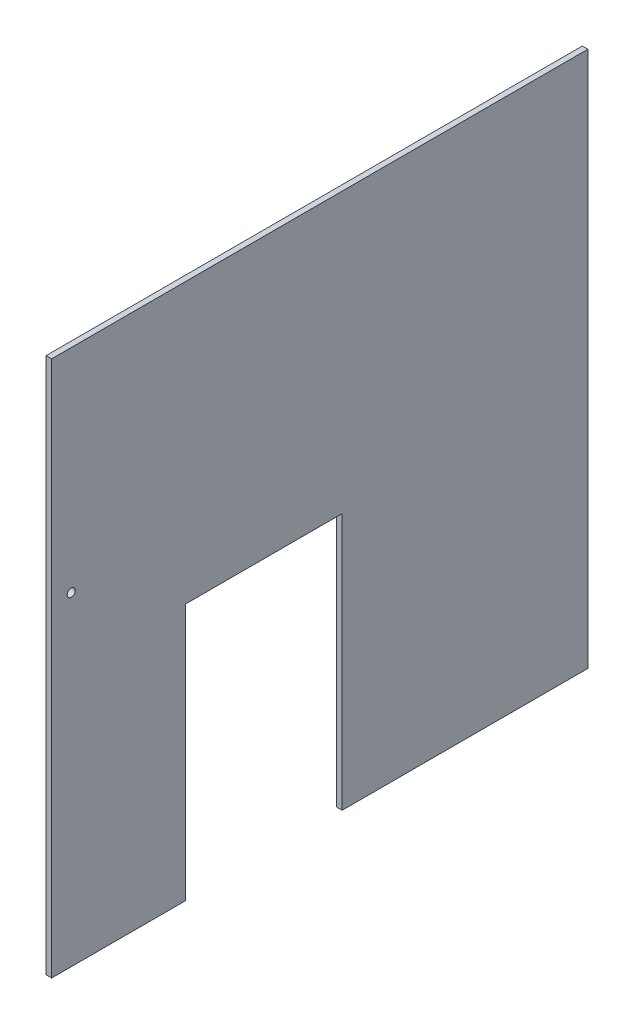
ISO-10303-21;
HEADER;
FILE_DESCRIPTION(('STEP AP214'),'2;1');
FILE_NAME('part.step','',(''),(''),'','','');
FILE_SCHEMA(('AUTOMOTIVE_DESIGN { 1 0 10303 214 1 1 1 1 }'));
ENDSEC;
DATA;
#1=APPLICATION_CONTEXT('core data for automotive mechanical design processes');
#2=APPLICATION_PROTOCOL_DEFINITION('international standard','automotive_design',2000,#1);
#3=PRODUCT_CONTEXT('',#1,'mechanical');
#4=PRODUCT('Part','Part','',(#3));
#5=PRODUCT_RELATED_PRODUCT_CATEGORY('part','',(#4));
#6=PRODUCT_DEFINITION_FORMATION('','',#4);
#7=PRODUCT_DEFINITION_CONTEXT('part definition',#1,'design');
#8=PRODUCT_DEFINITION('design','',#6,#7);
#9=PRODUCT_DEFINITION_SHAPE('','',#8);
#10=(LENGTH_UNIT() NAMED_UNIT(*) SI_UNIT(.MILLI.,.METRE.));
#11=(NAMED_UNIT(*) PLANE_ANGLE_UNIT() SI_UNIT($,.RADIAN.));
#12=(NAMED_UNIT(*) SI_UNIT($,.STERADIAN.) SOLID_ANGLE_UNIT());
#13=UNCERTAINTY_MEASURE_WITH_UNIT(LENGTH_MEASURE(1.E-05),#10,'distance_accuracy_value','');
#14=(GEOMETRIC_REPRESENTATION_CONTEXT(3) GLOBAL_UNCERTAINTY_ASSIGNED_CONTEXT((#13)) GLOBAL_UNIT_ASSIGNED_CONTEXT((#10,
#11,#12)) REPRESENTATION_CONTEXT('',''));
#15=CARTESIAN_POINT('',(0.,0.,0.));
#16=DIRECTION('',(0.,0.,1.));
#17=DIRECTION('',(1.,0.,0.));
#18=AXIS2_PLACEMENT_3D('',#15,#16,#17);
#19=CARTESIAN_POINT('',(3.175,0.,-12.7));
#20=DIRECTION('',(0.,0.,1.));
#21=DIRECTION('',(1.,0.,0.));
#22=AXIS2_PLACEMENT_3D('',#19,#20,#21);
#23=PLANE('',#22);
#24=DIRECTION('',(0.,1.,0.));
#25=VECTOR('',#24,1.);
#26=CARTESIAN_POINT('',(0.,0.,-12.7));
#27=LINE('',#26,#25);
#28=CARTESIAN_POINT('',(0.,-152.4,-12.7));
#29=VERTEX_POINT('',#28);
#30=CARTESIAN_POINT('',(0.,-6.34999999999999,-12.7));
#31=VERTEX_POINT('',#30);
#32=EDGE_CURVE('E138',#29,#31,#27,.T.);
#33=ORIENTED_EDGE('',*,*,#32,.F.);
#34=DIRECTION('',(-1.,0.,0.));
#35=VECTOR('',#34,1.);
#36=CARTESIAN_POINT('',(3.175,-152.4,-12.7));
#37=LINE('',#36,#35);
#38=CARTESIAN_POINT('',(3.175,-152.4,-12.7));
#39=VERTEX_POINT('',#38);
#40=EDGE_CURVE('E11',#39,#29,#37,.T.);
#41=ORIENTED_EDGE('',*,*,#40,.F.);
#42=DIRECTION('',(0.,1.,0.));
#43=VECTOR('',#42,1.);
#44=CARTESIAN_POINT('',(3.175,0.,-12.7));
#45=LINE('',#44,#43);
#46=CARTESIAN_POINT('',(3.175,-6.34999999999999,-12.7));
#47=VERTEX_POINT('',#46);
#48=EDGE_CURVE('E156',#39,#47,#45,.T.);
#49=ORIENTED_EDGE('',*,*,#48,.T.);
#50=DIRECTION('',(-1.,0.,0.));
#51=VECTOR('',#50,1.);
#52=CARTESIAN_POINT('',(3.175,-6.34999999999999,-12.7));
#53=LINE('',#52,#51);
#54=EDGE_CURVE('E93',#47,#31,#53,.T.);
#55=ORIENTED_EDGE('',*,*,#54,.T.);
#56=EDGE_LOOP('',(#33,#41,#49,#55));
#57=FACE_BOUND('',#56,.T.);
#58=ADVANCED_FACE('F42',(#57),#23,.T.);
#59=CARTESIAN_POINT('',(3.175,-152.4,0.));
#60=DIRECTION('',(0.,1.,0.));
#61=DIRECTION('',(0.,0.,1.));
#62=AXIS2_PLACEMENT_3D('',#59,#60,#61);
#63=PLANE('',#62);
#64=DIRECTION('',(0.,0.,-1.));
#65=VECTOR('',#64,1.);
#66=CARTESIAN_POINT('',(0.,-152.4,0.));
#67=LINE('',#66,#65);
#68=CARTESIAN_POINT('',(0.,-152.4,-152.4));
#69=VERTEX_POINT('',#68);
#70=EDGE_CURVE('E141',#29,#69,#67,.T.);
#71=ORIENTED_EDGE('',*,*,#70,.T.);
#72=DIRECTION('',(-1.,0.,0.));
#73=VECTOR('',#72,1.);
#74=CARTESIAN_POINT('',(3.175,-152.4,-152.4));
#75=LINE('',#74,#73);
#76=CARTESIAN_POINT('',(3.175,-152.4,-152.4));
#77=VERTEX_POINT('',#76);
#78=EDGE_CURVE('E50',#77,#69,#75,.T.);
#79=ORIENTED_EDGE('',*,*,#78,.F.);
#80=DIRECTION('',(0.,0.,-1.));
#81=VECTOR('',#80,1.);
#82=CARTESIAN_POINT('',(3.175,-152.4,0.));
#83=LINE('',#82,#81);
#84=EDGE_CURVE('E124',#39,#77,#83,.T.);
#85=ORIENTED_EDGE('',*,*,#84,.F.);
#86=ORIENTED_EDGE('',*,*,#40,.T.);
#87=EDGE_LOOP('',(#71,#79,#85,#86));
#88=FACE_BOUND('',#87,.T.);
#89=ADVANCED_FACE('F172',(#88),#63,.F.);
#90=CARTESIAN_POINT('',(3.175,0.,-152.4));
#91=DIRECTION('',(0.,0.,-1.));
#92=DIRECTION('',(0.,1.,0.));
#93=AXIS2_PLACEMENT_3D('',#90,#91,#92);
#94=PLANE('',#93);
#95=DIRECTION('',(0.,-1.,0.));
#96=VECTOR('',#95,1.);
#97=CARTESIAN_POINT('',(0.,0.,-152.4));
#98=LINE('',#97,#96);
#99=CARTESIAN_POINT('',(0.,152.4,-152.4));
#100=VERTEX_POINT('',#99);
#101=EDGE_CURVE('E145',#100,#69,#98,.T.);
#102=ORIENTED_EDGE('',*,*,#101,.F.);
#103=DIRECTION('',(-1.,0.,0.));
#104=VECTOR('',#103,1.);
#105=CARTESIAN_POINT('',(3.175,152.4,-152.4));
#106=LINE('',#105,#104);
#107=CARTESIAN_POINT('',(3.175,152.4,-152.4));
#108=VERTEX_POINT('',#107);
#109=EDGE_CURVE('E162',#108,#100,#106,.T.);
#110=ORIENTED_EDGE('',*,*,#109,.F.);
#111=DIRECTION('',(0.,-1.,0.));
#112=VECTOR('',#111,1.);
#113=CARTESIAN_POINT('',(3.175,0.,-152.4));
#114=LINE('',#113,#112);
#115=EDGE_CURVE('E169',#108,#77,#114,.T.);
#116=ORIENTED_EDGE('',*,*,#115,.T.);
#117=ORIENTED_EDGE('',*,*,#78,.T.);
#118=EDGE_LOOP('',(#102,#110,#116,#117));
#119=FACE_BOUND('',#118,.T.);
#120=ADVANCED_FACE('F167',(#119),#94,.T.);
#121=CARTESIAN_POINT('',(3.175,152.4,0.));
#122=DIRECTION('',(0.,1.,0.));
#123=DIRECTION('',(0.,0.,1.));
#124=AXIS2_PLACEMENT_3D('',#121,#122,#123);
#125=PLANE('',#124);
#126=DIRECTION('',(0.,0.,-1.));
#127=VECTOR('',#126,1.);
#128=CARTESIAN_POINT('',(0.,152.4,0.));
#129=LINE('',#128,#127);
#130=CARTESIAN_POINT('',(0.,152.4,152.4));
#131=VERTEX_POINT('',#130);
#132=EDGE_CURVE('E148',#131,#100,#129,.T.);
#133=ORIENTED_EDGE('',*,*,#132,.F.);
#134=DIRECTION('',(-1.,0.,0.));
#135=VECTOR('',#134,1.);
#136=CARTESIAN_POINT('',(3.175,152.4,152.4));
#137=LINE('',#136,#135);
#138=CARTESIAN_POINT('',(3.175,152.4,152.4));
#139=VERTEX_POINT('',#138);
#140=EDGE_CURVE('E160',#139,#131,#137,.T.);
#141=ORIENTED_EDGE('',*,*,#140,.F.);
#142=DIRECTION('',(0.,0.,-1.));
#143=VECTOR('',#142,1.);
#144=CARTESIAN_POINT('',(3.175,152.4,0.));
#145=LINE('',#144,#143);
#146=EDGE_CURVE('E180',#139,#108,#145,.T.);
#147=ORIENTED_EDGE('',*,*,#146,.T.);
#148=ORIENTED_EDGE('',*,*,#109,.T.);
#149=EDGE_LOOP('',(#133,#141,#147,#148));
#150=FACE_BOUND('',#149,.T.);
#151=ADVANCED_FACE('F178',(#150),#125,.T.);
#152=CARTESIAN_POINT('',(3.175,0.,152.4));
#153=DIRECTION('',(0.,0.,-1.));
#154=DIRECTION('',(0.,1.,0.));
#155=AXIS2_PLACEMENT_3D('',#152,#153,#154);
#156=PLANE('',#155);
#157=DIRECTION('',(0.,-1.,0.));
#158=VECTOR('',#157,1.);
#159=CARTESIAN_POINT('',(0.,0.,152.4));
#160=LINE('',#159,#158);
#161=CARTESIAN_POINT('',(0.,-152.4,152.4));
#162=VERTEX_POINT('',#161);
#163=EDGE_CURVE('E151',#131,#162,#160,.T.);
#164=ORIENTED_EDGE('',*,*,#163,.T.);
#165=DIRECTION('',(-1.,0.,0.));
#166=VECTOR('',#165,1.);
#167=CARTESIAN_POINT('',(3.175,-152.4,152.4));
#168=LINE('',#167,#166);
#169=CARTESIAN_POINT('',(3.175,-152.4,152.4));
#170=VERTEX_POINT('',#169);
#171=EDGE_CURVE('E129',#170,#162,#168,.T.);
#172=ORIENTED_EDGE('',*,*,#171,.F.);
#173=DIRECTION('',(0.,-1.,0.));
#174=VECTOR('',#173,1.);
#175=CARTESIAN_POINT('',(3.175,0.,152.4));
#176=LINE('',#175,#174);
#177=EDGE_CURVE('E119',#139,#170,#176,.T.);
#178=ORIENTED_EDGE('',*,*,#177,.F.);
#179=ORIENTED_EDGE('',*,*,#140,.T.);
#180=EDGE_LOOP('',(#164,#172,#178,#179));
#181=FACE_BOUND('',#180,.T.);
#182=ADVANCED_FACE('F219',(#181),#156,.F.);
#183=CARTESIAN_POINT('',(0.,-152.4,76.2));
#184=VERTEX_POINT('',#183);
#185=EDGE_CURVE('E128',#162,#184,#67,.T.);
#186=ORIENTED_EDGE('',*,*,#185,.T.);
#187=DIRECTION('',(-1.,0.,0.));
#188=VECTOR('',#187,1.);
#189=CARTESIAN_POINT('',(3.175,-152.4,76.2));
#190=LINE('',#189,#188);
#191=CARTESIAN_POINT('',(3.175,-152.4,76.2));
#192=VERTEX_POINT('',#191);
#193=EDGE_CURVE('E125',#192,#184,#190,.T.);
#194=ORIENTED_EDGE('',*,*,#193,.F.);
#195=EDGE_CURVE('E112',#170,#192,#83,.T.);
#196=ORIENTED_EDGE('',*,*,#195,.F.);
#197=ORIENTED_EDGE('',*,*,#171,.T.);
#198=EDGE_LOOP('',(#186,#194,#196,#197));
#199=FACE_BOUND('',#198,.T.);
#200=ADVANCED_FACE('F126',(#199),#63,.F.);
#201=CARTESIAN_POINT('',(3.175,0.,76.2));
#202=DIRECTION('',(0.,0.,1.));
#203=DIRECTION('',(1.,0.,0.));
#204=AXIS2_PLACEMENT_3D('',#201,#202,#203);
#205=PLANE('',#204);
#206=DIRECTION('',(0.,1.,0.));
#207=VECTOR('',#206,1.);
#208=CARTESIAN_POINT('',(0.,0.,76.2));
#209=LINE('',#208,#207);
#210=CARTESIAN_POINT('',(0.,-6.34999999999999,76.2));
#211=VERTEX_POINT('',#210);
#212=EDGE_CURVE('E86',#184,#211,#209,.T.);
#213=ORIENTED_EDGE('',*,*,#212,.T.);
#214=DIRECTION('',(-1.,0.,0.));
#215=VECTOR('',#214,1.);
#216=CARTESIAN_POINT('',(3.175,-6.34999999999999,76.2));
#217=LINE('',#216,#215);
#218=CARTESIAN_POINT('',(3.175,-6.34999999999999,76.2));
#219=VERTEX_POINT('',#218);
#220=EDGE_CURVE('E130',#219,#211,#217,.T.);
#221=ORIENTED_EDGE('',*,*,#220,.F.);
#222=DIRECTION('',(0.,1.,0.));
#223=VECTOR('',#222,1.);
#224=CARTESIAN_POINT('',(3.175,0.,76.2));
#225=LINE('',#224,#223);
#226=EDGE_CURVE('E116',#192,#219,#225,.T.);
#227=ORIENTED_EDGE('',*,*,#226,.F.);
#228=ORIENTED_EDGE('',*,*,#193,.T.);
#229=EDGE_LOOP('',(#213,#221,#227,#228));
#230=FACE_BOUND('',#229,.T.);
#231=ADVANCED_FACE('F132',(#230),#205,.F.);
#232=CARTESIAN_POINT('',(3.175,-6.34999999999999,0.));
#233=DIRECTION('',(0.,1.,0.));
#234=DIRECTION('',(0.,0.,1.));
#235=AXIS2_PLACEMENT_3D('',#232,#233,#234);
#236=PLANE('',#235);
#237=DIRECTION('',(0.,0.,-1.));
#238=VECTOR('',#237,1.);
#239=CARTESIAN_POINT('',(0.,-6.34999999999999,0.));
#240=LINE('',#239,#238);
#241=EDGE_CURVE('E154',#211,#31,#240,.T.);
#242=ORIENTED_EDGE('',*,*,#241,.T.);
#243=ORIENTED_EDGE('',*,*,#54,.F.);
#244=DIRECTION('',(0.,0.,-1.));
#245=VECTOR('',#244,1.);
#246=CARTESIAN_POINT('',(3.175,-6.34999999999999,0.));
#247=LINE('',#246,#245);
#248=EDGE_CURVE('E58',#219,#47,#247,.T.);
#249=ORIENTED_EDGE('',*,*,#248,.F.);
#250=ORIENTED_EDGE('',*,*,#220,.T.);
#251=EDGE_LOOP('',(#242,#243,#249,#250));
#252=FACE_BOUND('',#251,.T.);
#253=ADVANCED_FACE('F198',(#252),#236,.F.);
#254=CARTESIAN_POINT('',(3.175,0.,0.));
#255=DIRECTION('',(1.,0.,0.));
#256=DIRECTION('',(0.,0.,-1.));
#257=AXIS2_PLACEMENT_3D('',#254,#255,#256);
#258=PLANE('',#257);
#259=CARTESIAN_POINT('',(3.175,31.75,141.2875));
#260=DIRECTION('',(1.,0.,0.));
#261=DIRECTION('',(0.,0.,-1.));
#262=AXIS2_PLACEMENT_3D('',#259,#260,#261);
#263=CIRCLE('',#262,2.28600000000001);
#264=CARTESIAN_POINT('',(3.175,31.75,139.0015));
#265=VERTEX_POINT('',#264);
#266=EDGE_CURVE('E184',#265,#265,#263,.T.);
#267=ORIENTED_EDGE('',*,*,#266,.F.);
#268=EDGE_LOOP('',(#267));
#269=FACE_BOUND('',#268,.T.);
#270=ORIENTED_EDGE('',*,*,#48,.F.);
#271=ORIENTED_EDGE('',*,*,#84,.T.);
#272=ORIENTED_EDGE('',*,*,#115,.F.);
#273=ORIENTED_EDGE('',*,*,#146,.F.);
#274=ORIENTED_EDGE('',*,*,#177,.T.);
#275=ORIENTED_EDGE('',*,*,#195,.T.);
#276=ORIENTED_EDGE('',*,*,#226,.T.);
#277=ORIENTED_EDGE('',*,*,#248,.T.);
#278=EDGE_LOOP('',(#270,#271,#272,#273,#274,#275,#276,#277));
#279=FACE_BOUND('',#278,.T.);
#280=ADVANCED_FACE('F114',(#269,#279),#258,.T.);
#281=CARTESIAN_POINT('',(0.,0.,0.));
#282=DIRECTION('',(1.,0.,0.));
#283=DIRECTION('',(0.,0.,-1.));
#284=AXIS2_PLACEMENT_3D('',#281,#282,#283);
#285=PLANE('',#284);
#286=CARTESIAN_POINT('',(0.,31.75,141.2875));
#287=DIRECTION('',(1.,0.,0.));
#288=DIRECTION('',(0.,0.,-1.));
#289=AXIS2_PLACEMENT_3D('',#286,#287,#288);
#290=CIRCLE('',#289,2.28600000000001);
#291=CARTESIAN_POINT('',(0.,31.75,139.0015));
#292=VERTEX_POINT('',#291);
#293=EDGE_CURVE('E142',#292,#292,#290,.T.);
#294=ORIENTED_EDGE('',*,*,#293,.T.);
#295=EDGE_LOOP('',(#294));
#296=FACE_BOUND('',#295,.T.);
#297=ORIENTED_EDGE('',*,*,#32,.T.);
#298=ORIENTED_EDGE('',*,*,#241,.F.);
#299=ORIENTED_EDGE('',*,*,#212,.F.);
#300=ORIENTED_EDGE('',*,*,#185,.F.);
#301=ORIENTED_EDGE('',*,*,#163,.F.);
#302=ORIENTED_EDGE('',*,*,#132,.T.);
#303=ORIENTED_EDGE('',*,*,#101,.T.);
#304=ORIENTED_EDGE('',*,*,#70,.F.);
#305=EDGE_LOOP('',(#297,#298,#299,#300,#301,#302,#303,#304));
#306=FACE_BOUND('',#305,.T.);
#307=ADVANCED_FACE('F174',(#296,#306),#285,.F.);
#308=CARTESIAN_POINT('',(0.,31.75,141.2875));
#309=DIRECTION('',(1.,0.,0.));
#310=DIRECTION('',(0.,0.,-1.));
#311=AXIS2_PLACEMENT_3D('',#308,#309,#310);
#312=CYLINDRICAL_SURFACE('',#311,2.28600000000001);
#313=ORIENTED_EDGE('',*,*,#293,.F.);
#314=EDGE_LOOP('',(#313));
#315=FACE_BOUND('',#314,.T.);
#316=ORIENTED_EDGE('',*,*,#266,.T.);
#317=EDGE_LOOP('',(#316));
#318=FACE_BOUND('',#317,.T.);
#319=ADVANCED_FACE('F191',(#315,#318),#312,.F.);
#320=CLOSED_SHELL('',(#58,#89,#120,#151,#182,#200,#231,#253,#280,#307,#319));
#321=MANIFOLD_SOLID_BREP('B2',#320);
#322=ADVANCED_BREP_SHAPE_REPRESENTATION('',(#18,#321),#14);
#323=SHAPE_DEFINITION_REPRESENTATION(#9,#322);
ENDSEC;
END-ISO-10303-21;
